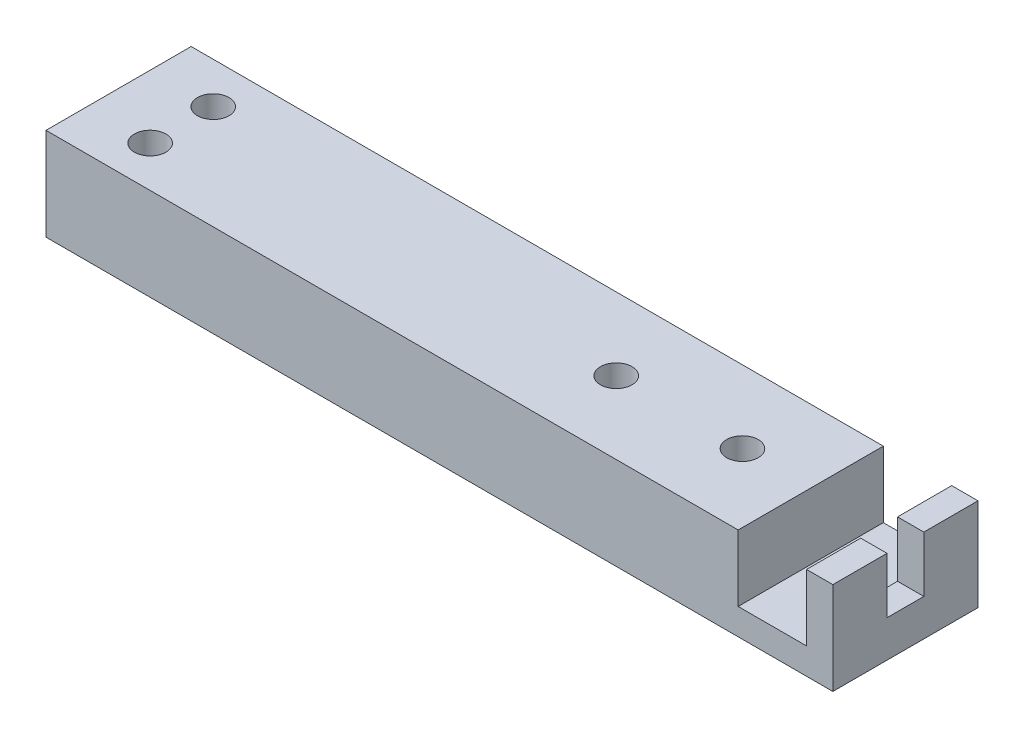
ISO-10303-21;
HEADER;
FILE_DESCRIPTION(('STEP AP214'),'2;1');
FILE_NAME('part.step','',(''),(''),'','','');
FILE_SCHEMA(('AUTOMOTIVE_DESIGN { 1 0 10303 214 1 1 1 1 }'));
ENDSEC;
DATA;
#1=APPLICATION_CONTEXT('core data for automotive mechanical design processes');
#2=APPLICATION_PROTOCOL_DEFINITION('international standard','automotive_design',2000,#1);
#3=PRODUCT_CONTEXT('',#1,'mechanical');
#4=PRODUCT('Part','Part','',(#3));
#5=PRODUCT_RELATED_PRODUCT_CATEGORY('part','',(#4));
#6=PRODUCT_DEFINITION_FORMATION('','',#4);
#7=PRODUCT_DEFINITION_CONTEXT('part definition',#1,'design');
#8=PRODUCT_DEFINITION('design','',#6,#7);
#9=PRODUCT_DEFINITION_SHAPE('','',#8);
#10=(LENGTH_UNIT() NAMED_UNIT(*) SI_UNIT(.MILLI.,.METRE.));
#11=(NAMED_UNIT(*) PLANE_ANGLE_UNIT() SI_UNIT($,.RADIAN.));
#12=(NAMED_UNIT(*) SI_UNIT($,.STERADIAN.) SOLID_ANGLE_UNIT());
#13=UNCERTAINTY_MEASURE_WITH_UNIT(LENGTH_MEASURE(1.E-05),#10,'distance_accuracy_value','');
#14=(GEOMETRIC_REPRESENTATION_CONTEXT(3) GLOBAL_UNCERTAINTY_ASSIGNED_CONTEXT((#13)) GLOBAL_UNIT_ASSIGNED_CONTEXT((#10,
#11,#12)) REPRESENTATION_CONTEXT('',''));
#15=CARTESIAN_POINT('',(0.,0.,0.));
#16=DIRECTION('',(0.,0.,1.));
#17=DIRECTION('',(1.,0.,0.));
#18=AXIS2_PLACEMENT_3D('',#15,#16,#17);
#19=CARTESIAN_POINT('',(0.,8.8,0.));
#20=DIRECTION('',(0.,-1.,0.));
#21=DIRECTION('',(0.,0.,-1.));
#22=AXIS2_PLACEMENT_3D('',#19,#20,#21);
#23=PLANE('',#22);
#24=DIRECTION('',(0.,0.,-1.));
#25=VECTOR('',#24,1.);
#26=CARTESIAN_POINT('',(34.9,8.8,6.9));
#27=LINE('',#26,#25);
#28=CARTESIAN_POINT('',(34.9,8.8,-1.75));
#29=VERTEX_POINT('',#28);
#30=CARTESIAN_POINT('',(34.9,8.8,-6.9));
#31=VERTEX_POINT('',#30);
#32=EDGE_CURVE('E154',#29,#31,#27,.T.);
#33=ORIENTED_EDGE('',*,*,#32,.F.);
#34=DIRECTION('',(1.,0.,0.));
#35=VECTOR('',#34,1.);
#36=CARTESIAN_POINT('',(34.6,8.8,-1.75));
#37=LINE('',#36,#35);
#38=CARTESIAN_POINT('',(37.4,8.8,-1.75));
#39=VERTEX_POINT('',#38);
#40=EDGE_CURVE('E138',#29,#39,#37,.T.);
#41=ORIENTED_EDGE('',*,*,#40,.T.);
#42=DIRECTION('',(0.,0.,-1.));
#43=VECTOR('',#42,1.);
#44=CARTESIAN_POINT('',(37.4,8.8,6.9));
#45=LINE('',#44,#43);
#46=CARTESIAN_POINT('',(37.4,8.8,-6.9));
#47=VERTEX_POINT('',#46);
#48=EDGE_CURVE('E152',#39,#47,#45,.T.);
#49=ORIENTED_EDGE('',*,*,#48,.T.);
#50=DIRECTION('',(-1.,0.,0.));
#51=VECTOR('',#50,1.);
#52=CARTESIAN_POINT('',(-37.4,8.8,-6.9));
#53=LINE('',#52,#51);
#54=EDGE_CURVE('E177',#47,#31,#53,.T.);
#55=ORIENTED_EDGE('',*,*,#54,.T.);
#56=EDGE_LOOP('',(#33,#41,#49,#55));
#57=FACE_BOUND('',#56,.T.);
#58=ADVANCED_FACE('F45',(#57),#23,.F.);
#59=CARTESIAN_POINT('',(-31.4,8.8,-3.));
#60=DIRECTION('',(0.,1.,0.));
#61=DIRECTION('',(0.,0.,1.));
#62=AXIS2_PLACEMENT_3D('',#59,#60,#61);
#63=CIRCLE('',#62,1.5);
#64=CARTESIAN_POINT('',(-31.4,8.8,-1.5));
#65=VERTEX_POINT('',#64);
#66=EDGE_CURVE('E310',#65,#65,#63,.T.);
#67=ORIENTED_EDGE('',*,*,#66,.F.);
#68=EDGE_LOOP('',(#67));
#69=FACE_BOUND('',#68,.T.);
#70=CARTESIAN_POINT('',(-31.4,8.8,3.));
#71=DIRECTION('',(0.,1.,0.));
#72=DIRECTION('',(0.,0.,1.));
#73=AXIS2_PLACEMENT_3D('',#70,#71,#72);
#74=CIRCLE('',#73,1.5);
#75=CARTESIAN_POINT('',(-31.4,8.8,4.5));
#76=VERTEX_POINT('',#75);
#77=EDGE_CURVE('E306',#76,#76,#74,.T.);
#78=ORIENTED_EDGE('',*,*,#77,.F.);
#79=EDGE_LOOP('',(#78));
#80=FACE_BOUND('',#79,.T.);
#81=CARTESIAN_POINT('',(21.91,8.8,0.));
#82=DIRECTION('',(0.,1.,0.));
#83=DIRECTION('',(0.,0.,1.));
#84=AXIS2_PLACEMENT_3D('',#81,#82,#83);
#85=CIRCLE('',#84,1.5);
#86=CARTESIAN_POINT('',(21.91,8.8,1.5));
#87=VERTEX_POINT('',#86);
#88=EDGE_CURVE('E295',#87,#87,#85,.T.);
#89=ORIENTED_EDGE('',*,*,#88,.F.);
#90=EDGE_LOOP('',(#89));
#91=FACE_BOUND('',#90,.T.);
#92=CARTESIAN_POINT('',(9.91,8.8,0.));
#93=DIRECTION('',(0.,1.,0.));
#94=DIRECTION('',(0.,0.,1.));
#95=AXIS2_PLACEMENT_3D('',#92,#93,#94);
#96=CIRCLE('',#95,1.5);
#97=CARTESIAN_POINT('',(9.91,8.8,1.5));
#98=VERTEX_POINT('',#97);
#99=EDGE_CURVE('E290',#98,#98,#96,.T.);
#100=ORIENTED_EDGE('',*,*,#99,.F.);
#101=EDGE_LOOP('',(#100));
#102=FACE_BOUND('',#101,.T.);
#103=DIRECTION('',(1.,0.,0.));
#104=VECTOR('',#103,1.);
#105=CARTESIAN_POINT('',(-37.4,8.8,6.9));
#106=LINE('',#105,#104);
#107=CARTESIAN_POINT('',(-37.4,8.8,6.9));
#108=VERTEX_POINT('',#107);
#109=CARTESIAN_POINT('',(28.4,8.8,6.9));
#110=VERTEX_POINT('',#109);
#111=EDGE_CURVE('E184',#108,#110,#106,.T.);
#112=ORIENTED_EDGE('',*,*,#111,.T.);
#113=DIRECTION('',(0.,0.,1.));
#114=VECTOR('',#113,1.);
#115=CARTESIAN_POINT('',(28.4,8.8,6.9));
#116=LINE('',#115,#114);
#117=CARTESIAN_POINT('',(28.4,8.8,-6.9));
#118=VERTEX_POINT('',#117);
#119=EDGE_CURVE('E230',#118,#110,#116,.T.);
#120=ORIENTED_EDGE('',*,*,#119,.F.);
#121=CARTESIAN_POINT('',(-37.4,8.8,-6.9));
#122=VERTEX_POINT('',#121);
#123=EDGE_CURVE('E170',#118,#122,#53,.T.);
#124=ORIENTED_EDGE('',*,*,#123,.T.);
#125=DIRECTION('',(0.,0.,1.));
#126=VECTOR('',#125,1.);
#127=CARTESIAN_POINT('',(-37.4,8.8,6.9));
#128=LINE('',#127,#126);
#129=EDGE_CURVE('E180',#122,#108,#128,.T.);
#130=ORIENTED_EDGE('',*,*,#129,.T.);
#131=EDGE_LOOP('',(#112,#120,#124,#130));
#132=FACE_BOUND('',#131,.T.);
#133=ADVANCED_FACE('F264',(#69,#80,#91,#102,#132),#23,.F.);
#134=CARTESIAN_POINT('',(37.4,8.8,6.9));
#135=DIRECTION('',(-1.,0.,0.));
#136=DIRECTION('',(0.,0.,1.));
#137=AXIS2_PLACEMENT_3D('',#134,#135,#136);
#138=PLANE('',#137);
#139=ORIENTED_EDGE('',*,*,#48,.F.);
#140=DIRECTION('',(0.,1.,0.));
#141=VECTOR('',#140,1.);
#142=CARTESIAN_POINT('',(37.4,8.8,-1.75));
#143=LINE('',#142,#141);
#144=CARTESIAN_POINT('',(37.4,3.5,-1.75));
#145=VERTEX_POINT('',#144);
#146=EDGE_CURVE('E135',#145,#39,#143,.T.);
#147=ORIENTED_EDGE('',*,*,#146,.F.);
#148=DIRECTION('',(0.,0.,-1.));
#149=VECTOR('',#148,1.);
#150=CARTESIAN_POINT('',(37.4,3.5,-1.75));
#151=LINE('',#150,#149);
#152=CARTESIAN_POINT('',(37.4,3.5,1.75));
#153=VERTEX_POINT('',#152);
#154=EDGE_CURVE('E157',#153,#145,#151,.T.);
#155=ORIENTED_EDGE('',*,*,#154,.F.);
#156=DIRECTION('',(0.,-1.,0.));
#157=VECTOR('',#156,1.);
#158=CARTESIAN_POINT('',(37.4,8.8,1.75));
#159=LINE('',#158,#157);
#160=CARTESIAN_POINT('',(37.4,8.8,1.75));
#161=VERTEX_POINT('',#160);
#162=EDGE_CURVE('E146',#161,#153,#159,.T.);
#163=ORIENTED_EDGE('',*,*,#162,.F.);
#164=CARTESIAN_POINT('',(37.4,8.8,6.9));
#165=VERTEX_POINT('',#164);
#166=EDGE_CURVE('E164',#165,#161,#45,.T.);
#167=ORIENTED_EDGE('',*,*,#166,.F.);
#168=DIRECTION('',(0.,-1.,0.));
#169=VECTOR('',#168,1.);
#170=CARTESIAN_POINT('',(37.4,8.8,6.9));
#171=LINE('',#170,#169);
#172=CARTESIAN_POINT('',(37.4,0.,6.9));
#173=VERTEX_POINT('',#172);
#174=EDGE_CURVE('E188',#165,#173,#171,.T.);
#175=ORIENTED_EDGE('',*,*,#174,.T.);
#176=DIRECTION('',(0.,0.,-1.));
#177=VECTOR('',#176,1.);
#178=CARTESIAN_POINT('',(37.4,0.,6.9));
#179=LINE('',#178,#177);
#180=CARTESIAN_POINT('',(37.4,0.,-6.9));
#181=VERTEX_POINT('',#180);
#182=EDGE_CURVE('E189',#173,#181,#179,.T.);
#183=ORIENTED_EDGE('',*,*,#182,.T.);
#184=DIRECTION('',(0.,-1.,0.));
#185=VECTOR('',#184,1.);
#186=CARTESIAN_POINT('',(37.4,8.8,-6.9));
#187=LINE('',#186,#185);
#188=EDGE_CURVE('E162',#47,#181,#187,.T.);
#189=ORIENTED_EDGE('',*,*,#188,.F.);
#190=EDGE_LOOP('',(#139,#147,#155,#163,#167,#175,#183,#189));
#191=FACE_BOUND('',#190,.T.);
#192=ADVANCED_FACE('F47',(#191),#138,.F.);
#193=CARTESIAN_POINT('',(-37.4,8.8,-6.9));
#194=DIRECTION('',(0.,0.,1.));
#195=DIRECTION('',(1.,0.,0.));
#196=AXIS2_PLACEMENT_3D('',#193,#194,#195);
#197=PLANE('',#196);
#198=ORIENTED_EDGE('',*,*,#123,.F.);
#199=DIRECTION('',(0.,1.,0.));
#200=VECTOR('',#199,1.);
#201=CARTESIAN_POINT('',(28.4,-15.2541797550704,-6.9));
#202=LINE('',#201,#200);
#203=CARTESIAN_POINT('',(28.4,2.5,-6.9));
#204=VERTEX_POINT('',#203);
#205=EDGE_CURVE('E238',#204,#118,#202,.T.);
#206=ORIENTED_EDGE('',*,*,#205,.F.);
#207=DIRECTION('',(-1.,0.,0.));
#208=VECTOR('',#207,1.);
#209=CARTESIAN_POINT('',(34.9,2.5,-6.9));
#210=LINE('',#209,#208);
#211=CARTESIAN_POINT('',(34.9,2.5,-6.9));
#212=VERTEX_POINT('',#211);
#213=EDGE_CURVE('E232',#212,#204,#210,.T.);
#214=ORIENTED_EDGE('',*,*,#213,.F.);
#215=DIRECTION('',(0.,1.,0.));
#216=VECTOR('',#215,1.);
#217=CARTESIAN_POINT('',(34.9,-15.2541797550704,-6.9));
#218=LINE('',#217,#216);
#219=EDGE_CURVE('E175',#212,#31,#218,.T.);
#220=ORIENTED_EDGE('',*,*,#219,.T.);
#221=ORIENTED_EDGE('',*,*,#54,.F.);
#222=ORIENTED_EDGE('',*,*,#188,.T.);
#223=DIRECTION('',(-1.,0.,0.));
#224=VECTOR('',#223,1.);
#225=CARTESIAN_POINT('',(-37.4,0.,-6.9));
#226=LINE('',#225,#224);
#227=CARTESIAN_POINT('',(-37.4,0.,-6.9));
#228=VERTEX_POINT('',#227);
#229=EDGE_CURVE('E192',#181,#228,#226,.T.);
#230=ORIENTED_EDGE('',*,*,#229,.T.);
#231=DIRECTION('',(0.,-1.,0.));
#232=VECTOR('',#231,1.);
#233=CARTESIAN_POINT('',(-37.4,8.8,-6.9));
#234=LINE('',#233,#232);
#235=EDGE_CURVE('E204',#122,#228,#234,.T.);
#236=ORIENTED_EDGE('',*,*,#235,.F.);
#237=EDGE_LOOP('',(#198,#206,#214,#220,#221,#222,#230,#236));
#238=FACE_BOUND('',#237,.T.);
#239=ADVANCED_FACE('F267',(#238),#197,.F.);
#240=CARTESIAN_POINT('',(-37.4,8.8,6.9));
#241=DIRECTION('',(1.,0.,0.));
#242=DIRECTION('',(0.,0.,-1.));
#243=AXIS2_PLACEMENT_3D('',#240,#241,#242);
#244=PLANE('',#243);
#245=DIRECTION('',(0.,0.,1.));
#246=VECTOR('',#245,1.);
#247=CARTESIAN_POINT('',(-37.4,0.,6.9));
#248=LINE('',#247,#246);
#249=CARTESIAN_POINT('',(-37.4,0.,6.9));
#250=VERTEX_POINT('',#249);
#251=EDGE_CURVE('E171',#228,#250,#248,.T.);
#252=ORIENTED_EDGE('',*,*,#251,.T.);
#253=DIRECTION('',(0.,-1.,0.));
#254=VECTOR('',#253,1.);
#255=CARTESIAN_POINT('',(-37.4,8.8,6.9));
#256=LINE('',#255,#254);
#257=EDGE_CURVE('E200',#108,#250,#256,.T.);
#258=ORIENTED_EDGE('',*,*,#257,.F.);
#259=ORIENTED_EDGE('',*,*,#129,.F.);
#260=ORIENTED_EDGE('',*,*,#235,.T.);
#261=EDGE_LOOP('',(#252,#258,#259,#260));
#262=FACE_BOUND('',#261,.T.);
#263=ADVANCED_FACE('F365',(#262),#244,.F.);
#264=CARTESIAN_POINT('',(-37.4,8.8,6.9));
#265=DIRECTION('',(0.,0.,-1.));
#266=DIRECTION('',(-1.,0.,0.));
#267=AXIS2_PLACEMENT_3D('',#264,#265,#266);
#268=PLANE('',#267);
#269=DIRECTION('',(1.,0.,0.));
#270=VECTOR('',#269,1.);
#271=CARTESIAN_POINT('',(34.9,2.5,6.9));
#272=LINE('',#271,#270);
#273=CARTESIAN_POINT('',(28.4,2.5,6.9));
#274=VERTEX_POINT('',#273);
#275=CARTESIAN_POINT('',(34.9,2.5,6.9));
#276=VERTEX_POINT('',#275);
#277=EDGE_CURVE('E242',#274,#276,#272,.T.);
#278=ORIENTED_EDGE('',*,*,#277,.F.);
#279=DIRECTION('',(0.,1.,0.));
#280=VECTOR('',#279,1.);
#281=CARTESIAN_POINT('',(28.4,-15.2541797550704,6.9));
#282=LINE('',#281,#280);
#283=EDGE_CURVE('E246',#274,#110,#282,.T.);
#284=ORIENTED_EDGE('',*,*,#283,.T.);
#285=ORIENTED_EDGE('',*,*,#111,.F.);
#286=ORIENTED_EDGE('',*,*,#257,.T.);
#287=DIRECTION('',(1.,0.,0.));
#288=VECTOR('',#287,1.);
#289=CARTESIAN_POINT('',(-37.4,0.,6.9));
#290=LINE('',#289,#288);
#291=EDGE_CURVE('E165',#250,#173,#290,.T.);
#292=ORIENTED_EDGE('',*,*,#291,.T.);
#293=ORIENTED_EDGE('',*,*,#174,.F.);
#294=CARTESIAN_POINT('',(34.9,8.8,6.9));
#295=VERTEX_POINT('',#294);
#296=EDGE_CURVE('E183',#295,#165,#106,.T.);
#297=ORIENTED_EDGE('',*,*,#296,.F.);
#298=DIRECTION('',(0.,1.,0.));
#299=VECTOR('',#298,1.);
#300=CARTESIAN_POINT('',(34.9,-15.2541797550704,6.9));
#301=LINE('',#300,#299);
#302=EDGE_CURVE('E69',#276,#295,#301,.T.);
#303=ORIENTED_EDGE('',*,*,#302,.F.);
#304=EDGE_LOOP('',(#278,#284,#285,#286,#292,#293,#297,#303));
#305=FACE_BOUND('',#304,.T.);
#306=ADVANCED_FACE('F279',(#305),#268,.F.);
#307=ORIENTED_EDGE('',*,*,#166,.T.);
#308=DIRECTION('',(1.,0.,0.));
#309=VECTOR('',#308,1.);
#310=CARTESIAN_POINT('',(34.6,8.8,1.75));
#311=LINE('',#310,#309);
#312=CARTESIAN_POINT('',(34.9,8.8,1.75));
#313=VERTEX_POINT('',#312);
#314=EDGE_CURVE('E156',#313,#161,#311,.T.);
#315=ORIENTED_EDGE('',*,*,#314,.F.);
#316=EDGE_CURVE('E222',#295,#313,#27,.T.);
#317=ORIENTED_EDGE('',*,*,#316,.F.);
#318=ORIENTED_EDGE('',*,*,#296,.T.);
#319=EDGE_LOOP('',(#307,#315,#317,#318));
#320=FACE_BOUND('',#319,.T.);
#321=ADVANCED_FACE('F274',(#320),#23,.F.);
#322=CARTESIAN_POINT('',(0.,0.,0.));
#323=DIRECTION('',(0.,-1.,0.));
#324=DIRECTION('',(0.,0.,-1.));
#325=AXIS2_PLACEMENT_3D('',#322,#323,#324);
#326=PLANE('',#325);
#327=ORIENTED_EDGE('',*,*,#182,.F.);
#328=ORIENTED_EDGE('',*,*,#291,.F.);
#329=ORIENTED_EDGE('',*,*,#251,.F.);
#330=ORIENTED_EDGE('',*,*,#229,.F.);
#331=EDGE_LOOP('',(#327,#328,#329,#330));
#332=FACE_BOUND('',#331,.T.);
#333=ADVANCED_FACE('F358',(#332),#326,.T.);
#334=CARTESIAN_POINT('',(0.,2.5,0.));
#335=DIRECTION('',(0.,-1.,0.));
#336=DIRECTION('',(0.,0.,-1.));
#337=AXIS2_PLACEMENT_3D('',#334,#335,#336);
#338=PLANE('',#337);
#339=DIRECTION('',(0.,0.,-1.));
#340=VECTOR('',#339,1.);
#341=CARTESIAN_POINT('',(34.9,2.5,6.9));
#342=LINE('',#341,#340);
#343=EDGE_CURVE('E239',#276,#212,#342,.T.);
#344=ORIENTED_EDGE('',*,*,#343,.T.);
#345=ORIENTED_EDGE('',*,*,#213,.T.);
#346=DIRECTION('',(0.,0.,1.));
#347=VECTOR('',#346,1.);
#348=CARTESIAN_POINT('',(28.4,2.5,6.9));
#349=LINE('',#348,#347);
#350=EDGE_CURVE('E247',#204,#274,#349,.T.);
#351=ORIENTED_EDGE('',*,*,#350,.T.);
#352=ORIENTED_EDGE('',*,*,#277,.T.);
#353=EDGE_LOOP('',(#344,#345,#351,#352));
#354=FACE_BOUND('',#353,.T.);
#355=ADVANCED_FACE('F363',(#354),#338,.F.);
#356=CARTESIAN_POINT('',(28.4,-15.2541797550704,6.9));
#357=DIRECTION('',(-1.,0.,0.));
#358=DIRECTION('',(0.,0.,1.));
#359=AXIS2_PLACEMENT_3D('',#356,#357,#358);
#360=PLANE('',#359);
#361=ORIENTED_EDGE('',*,*,#205,.T.);
#362=ORIENTED_EDGE('',*,*,#119,.T.);
#363=ORIENTED_EDGE('',*,*,#283,.F.);
#364=ORIENTED_EDGE('',*,*,#350,.F.);
#365=EDGE_LOOP('',(#361,#362,#363,#364));
#366=FACE_BOUND('',#365,.T.);
#367=ADVANCED_FACE('F259',(#366),#360,.F.);
#368=CARTESIAN_POINT('',(34.9,-15.2541797550704,6.9));
#369=DIRECTION('',(1.,0.,0.));
#370=DIRECTION('',(0.,0.,-1.));
#371=AXIS2_PLACEMENT_3D('',#368,#369,#370);
#372=PLANE('',#371);
#373=DIRECTION('',(0.,0.,-1.));
#374=VECTOR('',#373,1.);
#375=CARTESIAN_POINT('',(34.9,3.5,6.9));
#376=LINE('',#375,#374);
#377=CARTESIAN_POINT('',(34.9,3.5,1.75));
#378=VERTEX_POINT('',#377);
#379=CARTESIAN_POINT('',(34.9,3.5,-1.75));
#380=VERTEX_POINT('',#379);
#381=EDGE_CURVE('E54',#378,#380,#376,.T.);
#382=ORIENTED_EDGE('',*,*,#381,.T.);
#383=DIRECTION('',(0.,1.,0.));
#384=VECTOR('',#383,1.);
#385=CARTESIAN_POINT('',(34.9,-15.2541797550704,-1.75));
#386=LINE('',#385,#384);
#387=EDGE_CURVE('E12',#380,#29,#386,.T.);
#388=ORIENTED_EDGE('',*,*,#387,.T.);
#389=ORIENTED_EDGE('',*,*,#32,.T.);
#390=ORIENTED_EDGE('',*,*,#219,.F.);
#391=ORIENTED_EDGE('',*,*,#343,.F.);
#392=ORIENTED_EDGE('',*,*,#302,.T.);
#393=ORIENTED_EDGE('',*,*,#316,.T.);
#394=DIRECTION('',(0.,-1.,0.));
#395=VECTOR('',#394,1.);
#396=CARTESIAN_POINT('',(34.9,-15.2541797550704,1.74999999999999));
#397=LINE('',#396,#395);
#398=EDGE_CURVE('E210',#313,#378,#397,.T.);
#399=ORIENTED_EDGE('',*,*,#398,.T.);
#400=EDGE_LOOP('',(#382,#388,#389,#390,#391,#392,#393,#399));
#401=FACE_BOUND('',#400,.T.);
#402=ADVANCED_FACE('F215',(#401),#372,.F.);
#403=CARTESIAN_POINT('',(34.6,8.8,-1.75));
#404=DIRECTION('',(0.,0.,-1.));
#405=DIRECTION('',(0.,1.,0.));
#406=AXIS2_PLACEMENT_3D('',#403,#404,#405);
#407=PLANE('',#406);
#408=DIRECTION('',(1.,0.,0.));
#409=VECTOR('',#408,1.);
#410=CARTESIAN_POINT('',(34.6,3.5,-1.75));
#411=LINE('',#410,#409);
#412=EDGE_CURVE('E140',#380,#145,#411,.T.);
#413=ORIENTED_EDGE('',*,*,#412,.T.);
#414=ORIENTED_EDGE('',*,*,#146,.T.);
#415=ORIENTED_EDGE('',*,*,#40,.F.);
#416=ORIENTED_EDGE('',*,*,#387,.F.);
#417=EDGE_LOOP('',(#413,#414,#415,#416));
#418=FACE_BOUND('',#417,.T.);
#419=ADVANCED_FACE('F137',(#418),#407,.F.);
#420=CARTESIAN_POINT('',(34.6,3.5,-1.75));
#421=DIRECTION('',(0.,-1.,0.));
#422=DIRECTION('',(0.,0.,-1.));
#423=AXIS2_PLACEMENT_3D('',#420,#421,#422);
#424=PLANE('',#423);
#425=DIRECTION('',(1.,0.,0.));
#426=VECTOR('',#425,1.);
#427=CARTESIAN_POINT('',(34.6,3.5,1.75));
#428=LINE('',#427,#426);
#429=EDGE_CURVE('E61',#378,#153,#428,.T.);
#430=ORIENTED_EDGE('',*,*,#429,.T.);
#431=ORIENTED_EDGE('',*,*,#154,.T.);
#432=ORIENTED_EDGE('',*,*,#412,.F.);
#433=ORIENTED_EDGE('',*,*,#381,.F.);
#434=EDGE_LOOP('',(#430,#431,#432,#433));
#435=FACE_BOUND('',#434,.T.);
#436=ADVANCED_FACE('F217',(#435),#424,.F.);
#437=CARTESIAN_POINT('',(34.6,8.8,1.75));
#438=DIRECTION('',(0.,0.,1.));
#439=DIRECTION('',(0.,-1.,0.));
#440=AXIS2_PLACEMENT_3D('',#437,#438,#439);
#441=PLANE('',#440);
#442=ORIENTED_EDGE('',*,*,#314,.T.);
#443=ORIENTED_EDGE('',*,*,#162,.T.);
#444=ORIENTED_EDGE('',*,*,#429,.F.);
#445=ORIENTED_EDGE('',*,*,#398,.F.);
#446=EDGE_LOOP('',(#442,#443,#444,#445));
#447=FACE_BOUND('',#446,.T.);
#448=ADVANCED_FACE('F339',(#447),#441,.F.);
#449=CARTESIAN_POINT('',(9.91,1.8,0.));
#450=DIRECTION('',(0.,1.,0.));
#451=DIRECTION('',(0.,0.,1.));
#452=AXIS2_PLACEMENT_3D('',#449,#450,#451);
#453=CYLINDRICAL_SURFACE('',#452,1.5);
#454=CARTESIAN_POINT('',(9.91,1.8,0.));
#455=DIRECTION('',(0.,1.,0.));
#456=DIRECTION('',(0.,0.,1.));
#457=AXIS2_PLACEMENT_3D('',#454,#455,#456);
#458=CIRCLE('',#457,1.5);
#459=CARTESIAN_POINT('',(9.91,1.8,1.5));
#460=VERTEX_POINT('',#459);
#461=EDGE_CURVE('E286',#460,#460,#458,.T.);
#462=ORIENTED_EDGE('',*,*,#461,.F.);
#463=EDGE_LOOP('',(#462));
#464=FACE_BOUND('',#463,.T.);
#465=ORIENTED_EDGE('',*,*,#99,.T.);
#466=EDGE_LOOP('',(#465));
#467=FACE_BOUND('',#466,.T.);
#468=ADVANCED_FACE('F336',(#464,#467),#453,.F.);
#469=CARTESIAN_POINT('',(9.91,1.8,0.));
#470=DIRECTION('',(0.,1.,0.));
#471=DIRECTION('',(0.,0.,1.));
#472=AXIS2_PLACEMENT_3D('',#469,#470,#471);
#473=PLANE('',#472);
#474=ORIENTED_EDGE('',*,*,#461,.T.);
#475=EDGE_LOOP('',(#474));
#476=FACE_BOUND('',#475,.T.);
#477=ADVANCED_FACE('F338',(#476),#473,.T.);
#478=CARTESIAN_POINT('',(21.91,1.8,0.));
#479=DIRECTION('',(0.,1.,0.));
#480=DIRECTION('',(0.,0.,1.));
#481=AXIS2_PLACEMENT_3D('',#478,#479,#480);
#482=CYLINDRICAL_SURFACE('',#481,1.5);
#483=CARTESIAN_POINT('',(21.91,1.8,0.));
#484=DIRECTION('',(0.,1.,0.));
#485=DIRECTION('',(0.,0.,1.));
#486=AXIS2_PLACEMENT_3D('',#483,#484,#485);
#487=CIRCLE('',#486,1.5);
#488=CARTESIAN_POINT('',(21.91,1.8,1.5));
#489=VERTEX_POINT('',#488);
#490=EDGE_CURVE('E147',#489,#489,#487,.T.);
#491=ORIENTED_EDGE('',*,*,#490,.F.);
#492=EDGE_LOOP('',(#491));
#493=FACE_BOUND('',#492,.T.);
#494=ORIENTED_EDGE('',*,*,#88,.T.);
#495=EDGE_LOOP('',(#494));
#496=FACE_BOUND('',#495,.T.);
#497=ADVANCED_FACE('F346',(#493,#496),#482,.F.);
#498=CARTESIAN_POINT('',(21.91,1.8,0.));
#499=DIRECTION('',(0.,1.,0.));
#500=DIRECTION('',(0.,0.,1.));
#501=AXIS2_PLACEMENT_3D('',#498,#499,#500);
#502=PLANE('',#501);
#503=ORIENTED_EDGE('',*,*,#490,.T.);
#504=EDGE_LOOP('',(#503));
#505=FACE_BOUND('',#504,.T.);
#506=ADVANCED_FACE('F390',(#505),#502,.T.);
#507=CARTESIAN_POINT('',(-31.4,0.8,3.));
#508=DIRECTION('',(0.,1.,0.));
#509=DIRECTION('',(0.,0.,1.));
#510=AXIS2_PLACEMENT_3D('',#507,#508,#509);
#511=CYLINDRICAL_SURFACE('',#510,1.5);
#512=CARTESIAN_POINT('',(-31.4,0.8,3.));
#513=DIRECTION('',(0.,1.,0.));
#514=DIRECTION('',(0.,0.,1.));
#515=AXIS2_PLACEMENT_3D('',#512,#513,#514);
#516=CIRCLE('',#515,1.5);
#517=CARTESIAN_POINT('',(-31.4,0.8,4.5));
#518=VERTEX_POINT('',#517);
#519=EDGE_CURVE('E302',#518,#518,#516,.T.);
#520=ORIENTED_EDGE('',*,*,#519,.F.);
#521=EDGE_LOOP('',(#520));
#522=FACE_BOUND('',#521,.T.);
#523=ORIENTED_EDGE('',*,*,#77,.T.);
#524=EDGE_LOOP('',(#523));
#525=FACE_BOUND('',#524,.T.);
#526=ADVANCED_FACE('F395',(#522,#525),#511,.F.);
#527=CARTESIAN_POINT('',(-31.4,0.8,3.));
#528=DIRECTION('',(0.,1.,0.));
#529=DIRECTION('',(0.,0.,1.));
#530=AXIS2_PLACEMENT_3D('',#527,#528,#529);
#531=PLANE('',#530);
#532=ORIENTED_EDGE('',*,*,#519,.T.);
#533=EDGE_LOOP('',(#532));
#534=FACE_BOUND('',#533,.T.);
#535=ADVANCED_FACE('F323',(#534),#531,.T.);
#536=CARTESIAN_POINT('',(-31.4,0.8,-3.));
#537=DIRECTION('',(0.,1.,0.));
#538=DIRECTION('',(0.,0.,1.));
#539=AXIS2_PLACEMENT_3D('',#536,#537,#538);
#540=CYLINDRICAL_SURFACE('',#539,1.5);
#541=CARTESIAN_POINT('',(-31.4,0.8,-3.));
#542=DIRECTION('',(0.,1.,0.));
#543=DIRECTION('',(0.,0.,1.));
#544=AXIS2_PLACEMENT_3D('',#541,#542,#543);
#545=CIRCLE('',#544,1.5);
#546=CARTESIAN_POINT('',(-31.4,0.8,-1.5));
#547=VERTEX_POINT('',#546);
#548=EDGE_CURVE('E291',#547,#547,#545,.T.);
#549=ORIENTED_EDGE('',*,*,#548,.F.);
#550=EDGE_LOOP('',(#549));
#551=FACE_BOUND('',#550,.T.);
#552=ORIENTED_EDGE('',*,*,#66,.T.);
#553=EDGE_LOOP('',(#552));
#554=FACE_BOUND('',#553,.T.);
#555=ADVANCED_FACE('F320',(#551,#554),#540,.F.);
#556=CARTESIAN_POINT('',(-31.4,0.8,-3.));
#557=DIRECTION('',(0.,1.,0.));
#558=DIRECTION('',(0.,0.,1.));
#559=AXIS2_PLACEMENT_3D('',#556,#557,#558);
#560=PLANE('',#559);
#561=ORIENTED_EDGE('',*,*,#548,.T.);
#562=EDGE_LOOP('',(#561));
#563=FACE_BOUND('',#562,.T.);
#564=ADVANCED_FACE('F318',(#563),#560,.T.);
#565=CLOSED_SHELL('',(#58,#133,#192,#239,#263,#306,#321,#333,#355,#367,#402,#419,#436,#448,#468,
#477,#497,#506,#526,#535,#555,#564));
#566=MANIFOLD_SOLID_BREP('B2',#565);
#567=ADVANCED_BREP_SHAPE_REPRESENTATION('',(#18,#566),#14);
#568=SHAPE_DEFINITION_REPRESENTATION(#9,#567);
ENDSEC;
END-ISO-10303-21;
